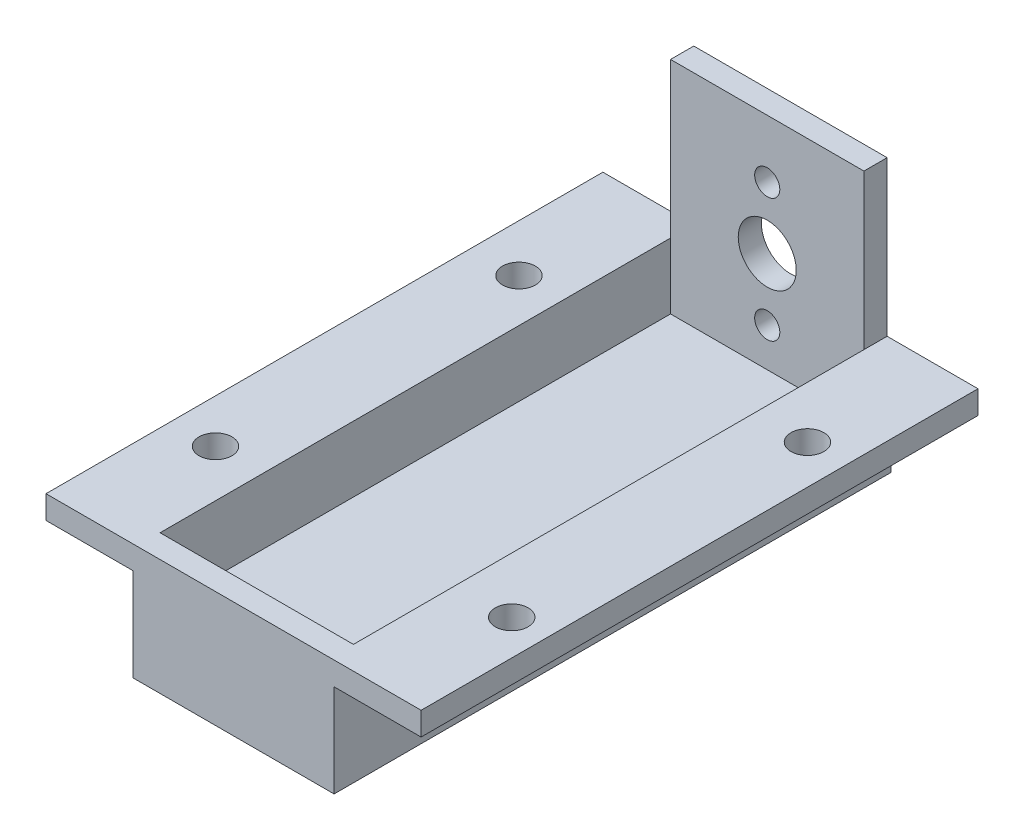
ISO-10303-21;
HEADER;
FILE_DESCRIPTION(('STEP AP214'),'2;1');
FILE_NAME('part.step','',(''),(''),'','','');
FILE_SCHEMA(('AUTOMOTIVE_DESIGN { 1 0 10303 214 1 1 1 1 }'));
ENDSEC;
DATA;
#1=APPLICATION_CONTEXT('core data for automotive mechanical design processes');
#2=APPLICATION_PROTOCOL_DEFINITION('international standard','automotive_design',2000,#1);
#3=PRODUCT_CONTEXT('',#1,'mechanical');
#4=PRODUCT('Part','Part','',(#3));
#5=PRODUCT_RELATED_PRODUCT_CATEGORY('part','',(#4));
#6=PRODUCT_DEFINITION_FORMATION('','',#4);
#7=PRODUCT_DEFINITION_CONTEXT('part definition',#1,'design');
#8=PRODUCT_DEFINITION('design','',#6,#7);
#9=PRODUCT_DEFINITION_SHAPE('','',#8);
#10=(LENGTH_UNIT() NAMED_UNIT(*) SI_UNIT(.MILLI.,.METRE.));
#11=(NAMED_UNIT(*) PLANE_ANGLE_UNIT() SI_UNIT($,.RADIAN.));
#12=(NAMED_UNIT(*) SI_UNIT($,.STERADIAN.) SOLID_ANGLE_UNIT());
#13=UNCERTAINTY_MEASURE_WITH_UNIT(LENGTH_MEASURE(1.E-05),#10,'distance_accuracy_value','');
#14=(GEOMETRIC_REPRESENTATION_CONTEXT(3) GLOBAL_UNCERTAINTY_ASSIGNED_CONTEXT((#13)) GLOBAL_UNIT_ASSIGNED_CONTEXT((#10,
#11,#12)) REPRESENTATION_CONTEXT('',''));
#15=CARTESIAN_POINT('',(0.,0.,0.));
#16=DIRECTION('',(0.,0.,1.));
#17=DIRECTION('',(1.,0.,0.));
#18=AXIS2_PLACEMENT_3D('',#15,#16,#17);
#19=CARTESIAN_POINT('',(12.5,0.,72.));
#20=DIRECTION('',(1.,0.,0.));
#21=DIRECTION('',(0.,1.,0.));
#22=AXIS2_PLACEMENT_3D('',#19,#20,#21);
#23=PLANE('',#22);
#24=DIRECTION('',(0.,0.,-1.));
#25=VECTOR('',#24,1.);
#26=CARTESIAN_POINT('',(12.5,0.,72.));
#27=LINE('',#26,#25);
#28=CARTESIAN_POINT('',(12.5,0.,2.99999999999999));
#29=VERTEX_POINT('',#28);
#30=CARTESIAN_POINT('',(12.5,0.,0.));
#31=VERTEX_POINT('',#30);
#32=EDGE_CURVE('E218',#29,#31,#27,.T.);
#33=ORIENTED_EDGE('',*,*,#32,.F.);
#34=DIRECTION('',(0.,1.,0.));
#35=VECTOR('',#34,1.);
#36=CARTESIAN_POINT('',(12.5,0.,2.99999999999999));
#37=LINE('',#36,#35);
#38=CARTESIAN_POINT('',(12.5,-20.,2.99999999999999));
#39=VERTEX_POINT('',#38);
#40=EDGE_CURVE('E310',#39,#29,#37,.T.);
#41=ORIENTED_EDGE('',*,*,#40,.F.);
#42=DIRECTION('',(0.,0.,-1.));
#43=VECTOR('',#42,1.);
#44=CARTESIAN_POINT('',(12.5,-20.,72.));
#45=LINE('',#44,#43);
#46=CARTESIAN_POINT('',(12.5,-20.,0.));
#47=VERTEX_POINT('',#46);
#48=EDGE_CURVE('E221',#39,#47,#45,.T.);
#49=ORIENTED_EDGE('',*,*,#48,.T.);
#50=DIRECTION('',(0.,-1.,0.));
#51=VECTOR('',#50,1.);
#52=CARTESIAN_POINT('',(12.5,0.,0.));
#53=LINE('',#52,#51);
#54=EDGE_CURVE('E190',#31,#47,#53,.T.);
#55=ORIENTED_EDGE('',*,*,#54,.F.);
#56=EDGE_LOOP('',(#33,#41,#49,#55));
#57=FACE_BOUND('',#56,.T.);
#58=ADVANCED_FACE('F45',(#57),#23,.T.);
#59=CARTESIAN_POINT('',(12.5,0.,72.));
#60=DIRECTION('',(0.,-1.,0.));
#61=DIRECTION('',(0.,0.,-1.));
#62=AXIS2_PLACEMENT_3D('',#59,#60,#61);
#63=PLANE('',#62);
#64=DIRECTION('',(-1.,0.,0.));
#65=VECTOR('',#64,1.);
#66=CARTESIAN_POINT('',(-12.5,0.,2.99999999999999));
#67=LINE('',#66,#65);
#68=CARTESIAN_POINT('',(-12.5,0.,2.99999999999999));
#69=VERTEX_POINT('',#68);
#70=EDGE_CURVE('E170',#29,#69,#67,.T.);
#71=ORIENTED_EDGE('',*,*,#70,.F.);
#72=ORIENTED_EDGE('',*,*,#32,.T.);
#73=DIRECTION('',(-1.,0.,0.));
#74=VECTOR('',#73,1.);
#75=CARTESIAN_POINT('',(12.5,0.,0.));
#76=LINE('',#75,#74);
#77=CARTESIAN_POINT('',(-12.5,0.,0.));
#78=VERTEX_POINT('',#77);
#79=EDGE_CURVE('E194',#31,#78,#76,.T.);
#80=ORIENTED_EDGE('',*,*,#79,.T.);
#81=DIRECTION('',(0.,0.,-1.));
#82=VECTOR('',#81,1.);
#83=CARTESIAN_POINT('',(-12.5,0.,72.));
#84=LINE('',#83,#82);
#85=EDGE_CURVE('E215',#69,#78,#84,.T.);
#86=ORIENTED_EDGE('',*,*,#85,.F.);
#87=EDGE_LOOP('',(#71,#72,#80,#86));
#88=FACE_BOUND('',#87,.T.);
#89=ADVANCED_FACE('F357',(#88),#63,.F.);
#90=CARTESIAN_POINT('',(-12.5,0.,72.));
#91=DIRECTION('',(1.,0.,0.));
#92=DIRECTION('',(0.,1.,0.));
#93=AXIS2_PLACEMENT_3D('',#90,#91,#92);
#94=PLANE('',#93);
#95=DIRECTION('',(0.,-1.,0.));
#96=VECTOR('',#95,1.);
#97=CARTESIAN_POINT('',(-12.5,0.,2.99999999999999));
#98=LINE('',#97,#96);
#99=CARTESIAN_POINT('',(-12.5,-20.,2.99999999999999));
#100=VERTEX_POINT('',#99);
#101=EDGE_CURVE('E295',#69,#100,#98,.T.);
#102=ORIENTED_EDGE('',*,*,#101,.F.);
#103=ORIENTED_EDGE('',*,*,#85,.T.);
#104=DIRECTION('',(0.,-1.,0.));
#105=VECTOR('',#104,1.);
#106=CARTESIAN_POINT('',(-12.5,0.,0.));
#107=LINE('',#106,#105);
#108=CARTESIAN_POINT('',(-12.5,-20.,0.));
#109=VERTEX_POINT('',#108);
#110=EDGE_CURVE('E198',#78,#109,#107,.T.);
#111=ORIENTED_EDGE('',*,*,#110,.T.);
#112=DIRECTION('',(0.,0.,-1.));
#113=VECTOR('',#112,1.);
#114=CARTESIAN_POINT('',(-12.5,-20.,72.));
#115=LINE('',#114,#113);
#116=EDGE_CURVE('E154',#100,#109,#115,.T.);
#117=ORIENTED_EDGE('',*,*,#116,.F.);
#118=EDGE_LOOP('',(#102,#103,#111,#117));
#119=FACE_BOUND('',#118,.T.);
#120=ADVANCED_FACE('F359',(#119),#94,.F.);
#121=CARTESIAN_POINT('',(-13.,-23.,72.));
#122=DIRECTION('',(1.,0.,0.));
#123=DIRECTION('',(0.,1.,0.));
#124=AXIS2_PLACEMENT_3D('',#121,#122,#123);
#125=PLANE('',#124);
#126=DIRECTION('',(0.,-1.,0.));
#127=VECTOR('',#126,1.);
#128=CARTESIAN_POINT('',(-13.,-23.,0.));
#129=LINE('',#128,#127);
#130=CARTESIAN_POINT('',(-13.,-23.,0.));
#131=VERTEX_POINT('',#130);
#132=CARTESIAN_POINT('',(-13.,-35.,0.));
#133=VERTEX_POINT('',#132);
#134=EDGE_CURVE('E165',#131,#133,#129,.T.);
#135=ORIENTED_EDGE('',*,*,#134,.T.);
#136=DIRECTION('',(0.,0.,-1.));
#137=VECTOR('',#136,1.);
#138=CARTESIAN_POINT('',(-13.,-35.,72.));
#139=LINE('',#138,#137);
#140=CARTESIAN_POINT('',(-13.,-35.,72.));
#141=VERTEX_POINT('',#140);
#142=EDGE_CURVE('E11',#141,#133,#139,.T.);
#143=ORIENTED_EDGE('',*,*,#142,.F.);
#144=DIRECTION('',(0.,-1.,0.));
#145=VECTOR('',#144,1.);
#146=CARTESIAN_POINT('',(-13.,-23.,72.));
#147=LINE('',#146,#145);
#148=CARTESIAN_POINT('',(-13.,-23.,72.));
#149=VERTEX_POINT('',#148);
#150=EDGE_CURVE('E208',#149,#141,#147,.T.);
#151=ORIENTED_EDGE('',*,*,#150,.F.);
#152=DIRECTION('',(0.,0.,-1.));
#153=VECTOR('',#152,1.);
#154=CARTESIAN_POINT('',(-13.,-23.,72.));
#155=LINE('',#154,#153);
#156=EDGE_CURVE('E161',#149,#131,#155,.T.);
#157=ORIENTED_EDGE('',*,*,#156,.T.);
#158=EDGE_LOOP('',(#135,#143,#151,#157));
#159=FACE_BOUND('',#158,.T.);
#160=ADVANCED_FACE('F47',(#159),#125,.F.);
#161=CARTESIAN_POINT('',(-13.,-35.,72.));
#162=DIRECTION('',(0.,1.,0.));
#163=DIRECTION('',(0.,0.,1.));
#164=AXIS2_PLACEMENT_3D('',#161,#162,#163);
#165=PLANE('',#164);
#166=DIRECTION('',(1.,0.,0.));
#167=VECTOR('',#166,1.);
#168=CARTESIAN_POINT('',(-13.,-35.,0.));
#169=LINE('',#168,#167);
#170=CARTESIAN_POINT('',(13.,-35.,0.));
#171=VERTEX_POINT('',#170);
#172=EDGE_CURVE('E169',#133,#171,#169,.T.);
#173=ORIENTED_EDGE('',*,*,#172,.T.);
#174=DIRECTION('',(0.,0.,-1.));
#175=VECTOR('',#174,1.);
#176=CARTESIAN_POINT('',(13.,-35.,72.));
#177=LINE('',#176,#175);
#178=CARTESIAN_POINT('',(13.,-35.,72.));
#179=VERTEX_POINT('',#178);
#180=EDGE_CURVE('E56',#179,#171,#177,.T.);
#181=ORIENTED_EDGE('',*,*,#180,.F.);
#182=DIRECTION('',(1.,0.,0.));
#183=VECTOR('',#182,1.);
#184=CARTESIAN_POINT('',(-13.,-35.,72.));
#185=LINE('',#184,#183);
#186=EDGE_CURVE('E121',#141,#179,#185,.T.);
#187=ORIENTED_EDGE('',*,*,#186,.F.);
#188=ORIENTED_EDGE('',*,*,#142,.T.);
#189=EDGE_LOOP('',(#173,#181,#187,#188));
#190=FACE_BOUND('',#189,.T.);
#191=ADVANCED_FACE('F417',(#190),#165,.F.);
#192=CARTESIAN_POINT('',(13.,-23.,72.));
#193=DIRECTION('',(1.,0.,0.));
#194=DIRECTION('',(0.,1.,0.));
#195=AXIS2_PLACEMENT_3D('',#192,#193,#194);
#196=PLANE('',#195);
#197=DIRECTION('',(0.,-1.,0.));
#198=VECTOR('',#197,1.);
#199=CARTESIAN_POINT('',(13.,-23.,0.));
#200=LINE('',#199,#198);
#201=CARTESIAN_POINT('',(13.,-23.,0.));
#202=VERTEX_POINT('',#201);
#203=EDGE_CURVE('E174',#202,#171,#200,.T.);
#204=ORIENTED_EDGE('',*,*,#203,.F.);
#205=DIRECTION('',(0.,0.,-1.));
#206=VECTOR('',#205,1.);
#207=CARTESIAN_POINT('',(13.,-23.,72.));
#208=LINE('',#207,#206);
#209=CARTESIAN_POINT('',(13.,-23.,72.));
#210=VERTEX_POINT('',#209);
#211=EDGE_CURVE('E230',#210,#202,#208,.T.);
#212=ORIENTED_EDGE('',*,*,#211,.F.);
#213=DIRECTION('',(0.,-1.,0.));
#214=VECTOR('',#213,1.);
#215=CARTESIAN_POINT('',(13.,-23.,72.));
#216=LINE('',#215,#214);
#217=EDGE_CURVE('E321',#210,#179,#216,.T.);
#218=ORIENTED_EDGE('',*,*,#217,.T.);
#219=ORIENTED_EDGE('',*,*,#180,.T.);
#220=EDGE_LOOP('',(#204,#212,#218,#219));
#221=FACE_BOUND('',#220,.T.);
#222=ADVANCED_FACE('F414',(#221),#196,.T.);
#223=CARTESIAN_POINT('',(24.25,-23.,72.));
#224=DIRECTION('',(0.,-1.,0.));
#225=DIRECTION('',(0.,0.,-1.));
#226=AXIS2_PLACEMENT_3D('',#223,#224,#225);
#227=PLANE('',#226);
#228=CARTESIAN_POINT('',(19.2,-23.,17.));
#229=DIRECTION('',(0.,-1.,0.));
#230=DIRECTION('',(0.,0.,-1.));
#231=AXIS2_PLACEMENT_3D('',#228,#229,#230);
#232=CIRCLE('',#231,2.125);
#233=CARTESIAN_POINT('',(19.2,-23.,14.875));
#234=VERTEX_POINT('',#233);
#235=EDGE_CURVE('E258',#234,#234,#232,.T.);
#236=ORIENTED_EDGE('',*,*,#235,.F.);
#237=EDGE_LOOP('',(#236));
#238=FACE_BOUND('',#237,.T.);
#239=CARTESIAN_POINT('',(19.7,-23.,55.7379233949007));
#240=DIRECTION('',(0.,-1.,0.));
#241=DIRECTION('',(0.,0.,-1.));
#242=AXIS2_PLACEMENT_3D('',#239,#240,#241);
#243=CIRCLE('',#242,2.125);
#244=CARTESIAN_POINT('',(19.7,-23.,53.6129233949007));
#245=VERTEX_POINT('',#244);
#246=EDGE_CURVE('E243',#245,#245,#243,.T.);
#247=ORIENTED_EDGE('',*,*,#246,.F.);
#248=EDGE_LOOP('',(#247));
#249=FACE_BOUND('',#248,.T.);
#250=DIRECTION('',(-1.,0.,0.));
#251=VECTOR('',#250,1.);
#252=CARTESIAN_POINT('',(24.25,-23.,0.));
#253=LINE('',#252,#251);
#254=CARTESIAN_POINT('',(24.25,-23.,0.));
#255=VERTEX_POINT('',#254);
#256=EDGE_CURVE('E178',#255,#202,#253,.T.);
#257=ORIENTED_EDGE('',*,*,#256,.F.);
#258=DIRECTION('',(0.,0.,-1.));
#259=VECTOR('',#258,1.);
#260=CARTESIAN_POINT('',(24.25,-23.,72.));
#261=LINE('',#260,#259);
#262=CARTESIAN_POINT('',(24.25,-23.,72.));
#263=VERTEX_POINT('',#262);
#264=EDGE_CURVE('E227',#263,#255,#261,.T.);
#265=ORIENTED_EDGE('',*,*,#264,.F.);
#266=DIRECTION('',(-1.,0.,0.));
#267=VECTOR('',#266,1.);
#268=CARTESIAN_POINT('',(24.25,-23.,72.));
#269=LINE('',#268,#267);
#270=EDGE_CURVE('E325',#263,#210,#269,.T.);
#271=ORIENTED_EDGE('',*,*,#270,.T.);
#272=ORIENTED_EDGE('',*,*,#211,.T.);
#273=EDGE_LOOP('',(#257,#265,#271,#272));
#274=FACE_BOUND('',#273,.T.);
#275=ADVANCED_FACE('F411',(#238,#249,#274),#227,.T.);
#276=CARTESIAN_POINT('',(24.25,-20.,72.));
#277=DIRECTION('',(1.,0.,0.));
#278=DIRECTION('',(0.,0.,-1.));
#279=AXIS2_PLACEMENT_3D('',#276,#277,#278);
#280=PLANE('',#279);
#281=DIRECTION('',(0.,-1.,0.));
#282=VECTOR('',#281,1.);
#283=CARTESIAN_POINT('',(24.25,-20.,0.));
#284=LINE('',#283,#282);
#285=CARTESIAN_POINT('',(24.25,-20.,0.));
#286=VERTEX_POINT('',#285);
#287=EDGE_CURVE('E182',#286,#255,#284,.T.);
#288=ORIENTED_EDGE('',*,*,#287,.F.);
#289=DIRECTION('',(0.,0.,-1.));
#290=VECTOR('',#289,1.);
#291=CARTESIAN_POINT('',(24.25,-20.,72.));
#292=LINE('',#291,#290);
#293=CARTESIAN_POINT('',(24.25,-20.,72.));
#294=VERTEX_POINT('',#293);
#295=EDGE_CURVE('E224',#294,#286,#292,.T.);
#296=ORIENTED_EDGE('',*,*,#295,.F.);
#297=DIRECTION('',(0.,-1.,0.));
#298=VECTOR('',#297,1.);
#299=CARTESIAN_POINT('',(24.25,-20.,72.));
#300=LINE('',#299,#298);
#301=EDGE_CURVE('E144',#294,#263,#300,.T.);
#302=ORIENTED_EDGE('',*,*,#301,.T.);
#303=ORIENTED_EDGE('',*,*,#264,.T.);
#304=EDGE_LOOP('',(#288,#296,#302,#303));
#305=FACE_BOUND('',#304,.T.);
#306=ADVANCED_FACE('F331',(#305),#280,.T.);
#307=CARTESIAN_POINT('',(-12.5,-20.,72.));
#308=DIRECTION('',(0.,-1.,0.));
#309=DIRECTION('',(1.,0.,0.));
#310=AXIS2_PLACEMENT_3D('',#307,#308,#309);
#311=PLANE('',#310);
#312=CARTESIAN_POINT('',(-18.6,-20.,55.7379233949007));
#313=DIRECTION('',(0.,1.,0.));
#314=DIRECTION('',(-1.,0.,0.));
#315=AXIS2_PLACEMENT_3D('',#312,#313,#314);
#316=CIRCLE('',#315,2.125);
#317=CARTESIAN_POINT('',(-20.725,-20.,55.7379233949007));
#318=VERTEX_POINT('',#317);
#319=EDGE_CURVE('E245',#318,#318,#316,.T.);
#320=ORIENTED_EDGE('',*,*,#319,.F.);
#321=EDGE_LOOP('',(#320));
#322=FACE_BOUND('',#321,.T.);
#323=CARTESIAN_POINT('',(19.2,-20.,17.));
#324=DIRECTION('',(0.,1.,0.));
#325=DIRECTION('',(-1.,0.,0.));
#326=AXIS2_PLACEMENT_3D('',#323,#324,#325);
#327=CIRCLE('',#326,2.125);
#328=CARTESIAN_POINT('',(17.075,-20.,17.));
#329=VERTEX_POINT('',#328);
#330=EDGE_CURVE('E251',#329,#329,#327,.T.);
#331=ORIENTED_EDGE('',*,*,#330,.F.);
#332=EDGE_LOOP('',(#331));
#333=FACE_BOUND('',#332,.T.);
#334=CARTESIAN_POINT('',(19.7,-20.,55.7379233949007));
#335=DIRECTION('',(0.,1.,0.));
#336=DIRECTION('',(-1.,0.,0.));
#337=AXIS2_PLACEMENT_3D('',#334,#335,#336);
#338=CIRCLE('',#337,2.125);
#339=CARTESIAN_POINT('',(17.575,-20.,55.7379233949007));
#340=VERTEX_POINT('',#339);
#341=EDGE_CURVE('E649',#340,#340,#338,.T.);
#342=ORIENTED_EDGE('',*,*,#341,.F.);
#343=EDGE_LOOP('',(#342));
#344=FACE_BOUND('',#343,.T.);
#345=CARTESIAN_POINT('',(-18.1,-20.,17.));
#346=DIRECTION('',(0.,1.,0.));
#347=DIRECTION('',(-1.,0.,0.));
#348=AXIS2_PLACEMENT_3D('',#345,#346,#347);
#349=CIRCLE('',#348,2.125);
#350=CARTESIAN_POINT('',(-20.225,-20.,17.));
#351=VERTEX_POINT('',#350);
#352=EDGE_CURVE('E237',#351,#351,#349,.T.);
#353=ORIENTED_EDGE('',*,*,#352,.F.);
#354=EDGE_LOOP('',(#353));
#355=FACE_BOUND('',#354,.T.);
#356=DIRECTION('',(1.,0.,0.));
#357=VECTOR('',#356,1.);
#358=CARTESIAN_POINT('',(12.5,-20.,69.));
#359=LINE('',#358,#357);
#360=CARTESIAN_POINT('',(-12.5,-20.,69.));
#361=VERTEX_POINT('',#360);
#362=CARTESIAN_POINT('',(12.5,-20.,69.));
#363=VERTEX_POINT('',#362);
#364=EDGE_CURVE('E284',#361,#363,#359,.T.);
#365=ORIENTED_EDGE('',*,*,#364,.F.);
#366=DIRECTION('',(0.,0.,1.));
#367=VECTOR('',#366,1.);
#368=CARTESIAN_POINT('',(-12.5,-20.,69.));
#369=LINE('',#368,#367);
#370=EDGE_CURVE('E262',#100,#361,#369,.T.);
#371=ORIENTED_EDGE('',*,*,#370,.F.);
#372=ORIENTED_EDGE('',*,*,#116,.T.);
#373=DIRECTION('',(-1.,0.,0.));
#374=VECTOR('',#373,1.);
#375=CARTESIAN_POINT('',(-12.5,-20.,0.));
#376=LINE('',#375,#374);
#377=CARTESIAN_POINT('',(-24.25,-20.,0.));
#378=VERTEX_POINT('',#377);
#379=EDGE_CURVE('E152',#109,#378,#376,.T.);
#380=ORIENTED_EDGE('',*,*,#379,.T.);
#381=DIRECTION('',(0.,0.,-1.));
#382=VECTOR('',#381,1.);
#383=CARTESIAN_POINT('',(-24.25,-20.,72.));
#384=LINE('',#383,#382);
#385=CARTESIAN_POINT('',(-24.25,-20.,72.));
#386=VERTEX_POINT('',#385);
#387=EDGE_CURVE('E148',#386,#378,#384,.T.);
#388=ORIENTED_EDGE('',*,*,#387,.F.);
#389=DIRECTION('',(1.,0.,0.));
#390=VECTOR('',#389,1.);
#391=CARTESIAN_POINT('',(12.5,-20.,72.));
#392=LINE('',#391,#390);
#393=EDGE_CURVE('E137',#386,#294,#392,.T.);
#394=ORIENTED_EDGE('',*,*,#393,.T.);
#395=ORIENTED_EDGE('',*,*,#295,.T.);
#396=DIRECTION('',(1.,0.,0.));
#397=VECTOR('',#396,1.);
#398=CARTESIAN_POINT('',(12.5,-20.,0.));
#399=LINE('',#398,#397);
#400=EDGE_CURVE('E186',#47,#286,#399,.T.);
#401=ORIENTED_EDGE('',*,*,#400,.F.);
#402=ORIENTED_EDGE('',*,*,#48,.F.);
#403=DIRECTION('',(0.,0.,-1.));
#404=VECTOR('',#403,1.);
#405=CARTESIAN_POINT('',(12.5,-20.,2.99999999999999));
#406=LINE('',#405,#404);
#407=EDGE_CURVE('E268',#363,#39,#406,.T.);
#408=ORIENTED_EDGE('',*,*,#407,.F.);
#409=EDGE_LOOP('',(#365,#371,#372,#380,#388,#394,#395,#401,#402,#408));
#410=FACE_BOUND('',#409,.T.);
#411=ADVANCED_FACE('F150',(#322,#333,#344,#355,#410),#311,.F.);
#412=CARTESIAN_POINT('',(-24.25,-20.,72.));
#413=DIRECTION('',(1.,0.,0.));
#414=DIRECTION('',(0.,0.,-1.));
#415=AXIS2_PLACEMENT_3D('',#412,#413,#414);
#416=PLANE('',#415);
#417=DIRECTION('',(0.,-1.,0.));
#418=VECTOR('',#417,1.);
#419=CARTESIAN_POINT('',(-24.25,-20.,0.));
#420=LINE('',#419,#418);
#421=CARTESIAN_POINT('',(-24.25,-23.,0.));
#422=VERTEX_POINT('',#421);
#423=EDGE_CURVE('E107',#378,#422,#420,.T.);
#424=ORIENTED_EDGE('',*,*,#423,.T.);
#425=DIRECTION('',(0.,0.,-1.));
#426=VECTOR('',#425,1.);
#427=CARTESIAN_POINT('',(-24.25,-23.,72.));
#428=LINE('',#427,#426);
#429=CARTESIAN_POINT('',(-24.25,-23.,72.));
#430=VERTEX_POINT('',#429);
#431=EDGE_CURVE('E155',#430,#422,#428,.T.);
#432=ORIENTED_EDGE('',*,*,#431,.F.);
#433=DIRECTION('',(0.,-1.,0.));
#434=VECTOR('',#433,1.);
#435=CARTESIAN_POINT('',(-24.25,-20.,72.));
#436=LINE('',#435,#434);
#437=EDGE_CURVE('E141',#386,#430,#436,.T.);
#438=ORIENTED_EDGE('',*,*,#437,.F.);
#439=ORIENTED_EDGE('',*,*,#387,.T.);
#440=EDGE_LOOP('',(#424,#432,#438,#439));
#441=FACE_BOUND('',#440,.T.);
#442=ADVANCED_FACE('F157',(#441),#416,.F.);
#443=CARTESIAN_POINT('',(-24.25,-23.,72.));
#444=DIRECTION('',(0.,1.,0.));
#445=DIRECTION('',(0.,0.,1.));
#446=AXIS2_PLACEMENT_3D('',#443,#444,#445);
#447=PLANE('',#446);
#448=CARTESIAN_POINT('',(-18.6,-23.,55.7379233949007));
#449=DIRECTION('',(0.,1.,0.));
#450=DIRECTION('',(0.,0.,1.));
#451=AXIS2_PLACEMENT_3D('',#448,#449,#450);
#452=CIRCLE('',#451,2.125);
#453=CARTESIAN_POINT('',(-18.6,-23.,57.8629233949007));
#454=VERTEX_POINT('',#453);
#455=EDGE_CURVE('E49',#454,#454,#452,.T.);
#456=ORIENTED_EDGE('',*,*,#455,.T.);
#457=EDGE_LOOP('',(#456));
#458=FACE_BOUND('',#457,.T.);
#459=CARTESIAN_POINT('',(-18.1,-23.,17.));
#460=DIRECTION('',(0.,1.,0.));
#461=DIRECTION('',(0.,0.,1.));
#462=AXIS2_PLACEMENT_3D('',#459,#460,#461);
#463=CIRCLE('',#462,2.125);
#464=CARTESIAN_POINT('',(-18.1,-23.,19.125));
#465=VERTEX_POINT('',#464);
#466=EDGE_CURVE('E234',#465,#465,#463,.T.);
#467=ORIENTED_EDGE('',*,*,#466,.T.);
#468=EDGE_LOOP('',(#467));
#469=FACE_BOUND('',#468,.T.);
#470=DIRECTION('',(1.,0.,0.));
#471=VECTOR('',#470,1.);
#472=CARTESIAN_POINT('',(-24.25,-23.,0.));
#473=LINE('',#472,#471);
#474=EDGE_CURVE('E113',#422,#131,#473,.T.);
#475=ORIENTED_EDGE('',*,*,#474,.T.);
#476=ORIENTED_EDGE('',*,*,#156,.F.);
#477=DIRECTION('',(1.,0.,0.));
#478=VECTOR('',#477,1.);
#479=CARTESIAN_POINT('',(-24.25,-23.,72.));
#480=LINE('',#479,#478);
#481=EDGE_CURVE('E65',#430,#149,#480,.T.);
#482=ORIENTED_EDGE('',*,*,#481,.F.);
#483=ORIENTED_EDGE('',*,*,#431,.T.);
#484=EDGE_LOOP('',(#475,#476,#482,#483));
#485=FACE_BOUND('',#484,.T.);
#486=ADVANCED_FACE('F429',(#458,#469,#485),#447,.F.);
#487=CARTESIAN_POINT('',(0.,0.,72.));
#488=DIRECTION('',(0.,0.,1.));
#489=DIRECTION('',(1.,0.,0.));
#490=AXIS2_PLACEMENT_3D('',#487,#488,#489);
#491=PLANE('',#490);
#492=ORIENTED_EDGE('',*,*,#393,.F.);
#493=ORIENTED_EDGE('',*,*,#437,.T.);
#494=ORIENTED_EDGE('',*,*,#481,.T.);
#495=ORIENTED_EDGE('',*,*,#150,.T.);
#496=ORIENTED_EDGE('',*,*,#186,.T.);
#497=ORIENTED_EDGE('',*,*,#217,.F.);
#498=ORIENTED_EDGE('',*,*,#270,.F.);
#499=ORIENTED_EDGE('',*,*,#301,.F.);
#500=EDGE_LOOP('',(#492,#493,#494,#495,#496,#497,#498,#499));
#501=FACE_BOUND('',#500,.T.);
#502=ADVANCED_FACE('F139',(#501),#491,.T.);
#503=CARTESIAN_POINT('',(0.,0.,0.));
#504=DIRECTION('',(0.,0.,1.));
#505=DIRECTION('',(1.,0.,0.));
#506=AXIS2_PLACEMENT_3D('',#503,#504,#505);
#507=PLANE('',#506);
#508=CARTESIAN_POINT('',(0.,-7.5,0.));
#509=DIRECTION('',(0.,0.,-1.));
#510=DIRECTION('',(-1.,0.,0.));
#511=AXIS2_PLACEMENT_3D('',#508,#509,#510);
#512=CIRCLE('',#511,1.625);
#513=CARTESIAN_POINT('',(-1.625,-7.5,0.));
#514=VERTEX_POINT('',#513);
#515=EDGE_CURVE('E628',#514,#514,#512,.T.);
#516=ORIENTED_EDGE('',*,*,#515,.F.);
#517=EDGE_LOOP('',(#516));
#518=FACE_BOUND('',#517,.T.);
#519=CARTESIAN_POINT('',(0.,-15.5,0.));
#520=DIRECTION('',(0.,0.,-1.));
#521=DIRECTION('',(-1.,0.,0.));
#522=AXIS2_PLACEMENT_3D('',#519,#520,#521);
#523=CIRCLE('',#522,3.75);
#524=CARTESIAN_POINT('',(-3.75,-15.5,0.));
#525=VERTEX_POINT('',#524);
#526=EDGE_CURVE('E632',#525,#525,#523,.T.);
#527=ORIENTED_EDGE('',*,*,#526,.F.);
#528=EDGE_LOOP('',(#527));
#529=FACE_BOUND('',#528,.T.);
#530=CARTESIAN_POINT('',(0.,-23.5,0.));
#531=DIRECTION('',(0.,0.,-1.));
#532=DIRECTION('',(-1.,0.,0.));
#533=AXIS2_PLACEMENT_3D('',#530,#531,#532);
#534=CIRCLE('',#533,1.625);
#535=CARTESIAN_POINT('',(-1.625,-23.5,0.));
#536=VERTEX_POINT('',#535);
#537=EDGE_CURVE('E635',#536,#536,#534,.T.);
#538=ORIENTED_EDGE('',*,*,#537,.F.);
#539=EDGE_LOOP('',(#538));
#540=FACE_BOUND('',#539,.T.);
#541=ORIENTED_EDGE('',*,*,#134,.F.);
#542=ORIENTED_EDGE('',*,*,#474,.F.);
#543=ORIENTED_EDGE('',*,*,#423,.F.);
#544=ORIENTED_EDGE('',*,*,#379,.F.);
#545=ORIENTED_EDGE('',*,*,#110,.F.);
#546=ORIENTED_EDGE('',*,*,#79,.F.);
#547=ORIENTED_EDGE('',*,*,#54,.T.);
#548=ORIENTED_EDGE('',*,*,#400,.T.);
#549=ORIENTED_EDGE('',*,*,#287,.T.);
#550=ORIENTED_EDGE('',*,*,#256,.T.);
#551=ORIENTED_EDGE('',*,*,#203,.T.);
#552=ORIENTED_EDGE('',*,*,#172,.F.);
#553=EDGE_LOOP('',(#541,#542,#543,#544,#545,#546,#547,#548,#549,#550,#551,#552));
#554=FACE_BOUND('',#553,.T.);
#555=ADVANCED_FACE('F341',(#518,#529,#540,#554),#507,.F.);
#556=CARTESIAN_POINT('',(0.,0.,2.99999999999999));
#557=DIRECTION('',(0.,0.,1.));
#558=DIRECTION('',(1.,0.,0.));
#559=AXIS2_PLACEMENT_3D('',#556,#557,#558);
#560=PLANE('',#559);
#561=CARTESIAN_POINT('',(0.,-7.5,3.));
#562=DIRECTION('',(0.,0.,-1.));
#563=DIRECTION('',(-1.,0.,0.));
#564=AXIS2_PLACEMENT_3D('',#561,#562,#563);
#565=CIRCLE('',#564,1.625);
#566=CARTESIAN_POINT('',(-1.625,-7.5,3.));
#567=VERTEX_POINT('',#566);
#568=EDGE_CURVE('E652',#567,#567,#565,.T.);
#569=ORIENTED_EDGE('',*,*,#568,.T.);
#570=EDGE_LOOP('',(#569));
#571=FACE_BOUND('',#570,.T.);
#572=CARTESIAN_POINT('',(0.,-15.5,3.));
#573=DIRECTION('',(0.,0.,-1.));
#574=DIRECTION('',(-1.,0.,0.));
#575=AXIS2_PLACEMENT_3D('',#572,#573,#574);
#576=CIRCLE('',#575,3.75);
#577=CARTESIAN_POINT('',(-3.75,-15.5,3.));
#578=VERTEX_POINT('',#577);
#579=EDGE_CURVE('E638',#578,#578,#576,.T.);
#580=ORIENTED_EDGE('',*,*,#579,.T.);
#581=EDGE_LOOP('',(#580));
#582=FACE_BOUND('',#581,.T.);
#583=CARTESIAN_POINT('',(0.,-23.5,3.));
#584=DIRECTION('',(0.,0.,-1.));
#585=DIRECTION('',(-1.,0.,0.));
#586=AXIS2_PLACEMENT_3D('',#583,#584,#585);
#587=CIRCLE('',#586,1.625);
#588=CARTESIAN_POINT('',(-1.625,-23.5,3.));
#589=VERTEX_POINT('',#588);
#590=EDGE_CURVE('E639',#589,#589,#587,.T.);
#591=ORIENTED_EDGE('',*,*,#590,.T.);
#592=EDGE_LOOP('',(#591));
#593=FACE_BOUND('',#592,.T.);
#594=ORIENTED_EDGE('',*,*,#101,.T.);
#595=DIRECTION('',(0.,1.,0.));
#596=VECTOR('',#595,1.);
#597=CARTESIAN_POINT('',(-12.5,-28.5,2.99999999999999));
#598=LINE('',#597,#596);
#599=CARTESIAN_POINT('',(-12.5,-28.5,2.99999999999999));
#600=VERTEX_POINT('',#599);
#601=EDGE_CURVE('E291',#600,#100,#598,.T.);
#602=ORIENTED_EDGE('',*,*,#601,.F.);
#603=DIRECTION('',(-1.,0.,0.));
#604=VECTOR('',#603,1.);
#605=CARTESIAN_POINT('',(-12.5,-28.5,2.99999999999999));
#606=LINE('',#605,#604);
#607=CARTESIAN_POINT('',(12.5,-28.5,2.99999999999999));
#608=VERTEX_POINT('',#607);
#609=EDGE_CURVE('E276',#608,#600,#606,.T.);
#610=ORIENTED_EDGE('',*,*,#609,.F.);
#611=DIRECTION('',(0.,1.,0.));
#612=VECTOR('',#611,1.);
#613=CARTESIAN_POINT('',(12.5,-28.5,2.99999999999999));
#614=LINE('',#613,#612);
#615=EDGE_CURVE('E296',#608,#39,#614,.T.);
#616=ORIENTED_EDGE('',*,*,#615,.T.);
#617=ORIENTED_EDGE('',*,*,#40,.T.);
#618=ORIENTED_EDGE('',*,*,#70,.T.);
#619=EDGE_LOOP('',(#594,#602,#610,#616,#617,#618));
#620=FACE_BOUND('',#619,.T.);
#621=ADVANCED_FACE('F351',(#571,#582,#593,#620),#560,.T.);
#622=CARTESIAN_POINT('',(-12.5,-28.5,69.));
#623=DIRECTION('',(-1.,0.,0.));
#624=DIRECTION('',(0.,-1.,0.));
#625=AXIS2_PLACEMENT_3D('',#622,#623,#624);
#626=PLANE('',#625);
#627=ORIENTED_EDGE('',*,*,#370,.T.);
#628=DIRECTION('',(0.,1.,0.));
#629=VECTOR('',#628,1.);
#630=CARTESIAN_POINT('',(-12.5,-28.5,69.));
#631=LINE('',#630,#629);
#632=CARTESIAN_POINT('',(-12.5,-28.5,69.));
#633=VERTEX_POINT('',#632);
#634=EDGE_CURVE('E280',#633,#361,#631,.T.);
#635=ORIENTED_EDGE('',*,*,#634,.F.);
#636=DIRECTION('',(0.,0.,1.));
#637=VECTOR('',#636,1.);
#638=CARTESIAN_POINT('',(-12.5,-28.5,69.));
#639=LINE('',#638,#637);
#640=EDGE_CURVE('E263',#600,#633,#639,.T.);
#641=ORIENTED_EDGE('',*,*,#640,.F.);
#642=ORIENTED_EDGE('',*,*,#601,.T.);
#643=EDGE_LOOP('',(#627,#635,#641,#642));
#644=FACE_BOUND('',#643,.T.);
#645=ADVANCED_FACE('F388',(#644),#626,.F.);
#646=CARTESIAN_POINT('',(12.5,-28.5,2.99999999999999));
#647=DIRECTION('',(1.,0.,0.));
#648=DIRECTION('',(0.,1.,0.));
#649=AXIS2_PLACEMENT_3D('',#646,#647,#648);
#650=PLANE('',#649);
#651=ORIENTED_EDGE('',*,*,#407,.T.);
#652=ORIENTED_EDGE('',*,*,#615,.F.);
#653=DIRECTION('',(0.,0.,-1.));
#654=VECTOR('',#653,1.);
#655=CARTESIAN_POINT('',(12.5,-28.5,2.99999999999999));
#656=LINE('',#655,#654);
#657=CARTESIAN_POINT('',(12.5,-28.5,69.));
#658=VERTEX_POINT('',#657);
#659=EDGE_CURVE('E272',#658,#608,#656,.T.);
#660=ORIENTED_EDGE('',*,*,#659,.F.);
#661=DIRECTION('',(0.,1.,0.));
#662=VECTOR('',#661,1.);
#663=CARTESIAN_POINT('',(12.5,-28.5,69.));
#664=LINE('',#663,#662);
#665=EDGE_CURVE('E300',#658,#363,#664,.T.);
#666=ORIENTED_EDGE('',*,*,#665,.T.);
#667=EDGE_LOOP('',(#651,#652,#660,#666));
#668=FACE_BOUND('',#667,.T.);
#669=ADVANCED_FACE('F385',(#668),#650,.F.);
#670=CARTESIAN_POINT('',(12.5,-28.5,69.));
#671=DIRECTION('',(0.,0.,1.));
#672=DIRECTION('',(1.,0.,0.));
#673=AXIS2_PLACEMENT_3D('',#670,#671,#672);
#674=PLANE('',#673);
#675=ORIENTED_EDGE('',*,*,#364,.T.);
#676=ORIENTED_EDGE('',*,*,#665,.F.);
#677=DIRECTION('',(1.,0.,0.));
#678=VECTOR('',#677,1.);
#679=CARTESIAN_POINT('',(12.5,-28.5,69.));
#680=LINE('',#679,#678);
#681=EDGE_CURVE('E267',#633,#658,#680,.T.);
#682=ORIENTED_EDGE('',*,*,#681,.F.);
#683=ORIENTED_EDGE('',*,*,#634,.T.);
#684=EDGE_LOOP('',(#675,#676,#682,#683));
#685=FACE_BOUND('',#684,.T.);
#686=ADVANCED_FACE('F383',(#685),#674,.F.);
#687=CARTESIAN_POINT('',(0.,-28.5,0.));
#688=DIRECTION('',(0.,-1.,0.));
#689=DIRECTION('',(1.,0.,0.));
#690=AXIS2_PLACEMENT_3D('',#687,#688,#689);
#691=PLANE('',#690);
#692=ORIENTED_EDGE('',*,*,#640,.T.);
#693=ORIENTED_EDGE('',*,*,#681,.T.);
#694=ORIENTED_EDGE('',*,*,#659,.T.);
#695=ORIENTED_EDGE('',*,*,#609,.T.);
#696=EDGE_LOOP('',(#692,#693,#694,#695));
#697=FACE_BOUND('',#696,.T.);
#698=ADVANCED_FACE('F387',(#697),#691,.F.);
#699=CARTESIAN_POINT('',(-18.1,-28.5,17.));
#700=DIRECTION('',(0.,1.,0.));
#701=DIRECTION('',(-1.,0.,0.));
#702=AXIS2_PLACEMENT_3D('',#699,#700,#701);
#703=CYLINDRICAL_SURFACE('',#702,2.125);
#704=ORIENTED_EDGE('',*,*,#352,.T.);
#705=EDGE_LOOP('',(#704));
#706=FACE_BOUND('',#705,.T.);
#707=ORIENTED_EDGE('',*,*,#466,.F.);
#708=EDGE_LOOP('',(#707));
#709=FACE_BOUND('',#708,.T.);
#710=ADVANCED_FACE('F491',(#706,#709),#703,.F.);
#711=CARTESIAN_POINT('',(-18.6,-28.5,55.7379233949007));
#712=DIRECTION('',(0.,1.,0.));
#713=DIRECTION('',(-1.,0.,0.));
#714=AXIS2_PLACEMENT_3D('',#711,#712,#713);
#715=CYLINDRICAL_SURFACE('',#714,2.125);
#716=ORIENTED_EDGE('',*,*,#319,.T.);
#717=EDGE_LOOP('',(#716));
#718=FACE_BOUND('',#717,.T.);
#719=ORIENTED_EDGE('',*,*,#455,.F.);
#720=EDGE_LOOP('',(#719));
#721=FACE_BOUND('',#720,.T.);
#722=ADVANCED_FACE('F498',(#718,#721),#715,.F.);
#723=CARTESIAN_POINT('',(19.7,-28.5,55.7379233949007));
#724=DIRECTION('',(0.,1.,0.));
#725=DIRECTION('',(-1.,0.,0.));
#726=AXIS2_PLACEMENT_3D('',#723,#724,#725);
#727=CYLINDRICAL_SURFACE('',#726,2.125);
#728=ORIENTED_EDGE('',*,*,#246,.T.);
#729=EDGE_LOOP('',(#728));
#730=FACE_BOUND('',#729,.T.);
#731=ORIENTED_EDGE('',*,*,#341,.T.);
#732=EDGE_LOOP('',(#731));
#733=FACE_BOUND('',#732,.T.);
#734=ADVANCED_FACE('F506',(#730,#733),#727,.F.);
#735=CARTESIAN_POINT('',(19.2,-28.5,17.));
#736=DIRECTION('',(0.,1.,0.));
#737=DIRECTION('',(-1.,0.,0.));
#738=AXIS2_PLACEMENT_3D('',#735,#736,#737);
#739=CYLINDRICAL_SURFACE('',#738,2.125);
#740=ORIENTED_EDGE('',*,*,#235,.T.);
#741=EDGE_LOOP('',(#740));
#742=FACE_BOUND('',#741,.T.);
#743=ORIENTED_EDGE('',*,*,#330,.T.);
#744=EDGE_LOOP('',(#743));
#745=FACE_BOUND('',#744,.T.);
#746=ADVANCED_FACE('F515',(#742,#745),#739,.F.);
#747=CARTESIAN_POINT('',(0.,-23.5,3.));
#748=DIRECTION('',(0.,0.,-1.));
#749=DIRECTION('',(-1.,0.,0.));
#750=AXIS2_PLACEMENT_3D('',#747,#748,#749);
#751=CYLINDRICAL_SURFACE('',#750,1.625);
#752=ORIENTED_EDGE('',*,*,#590,.F.);
#753=EDGE_LOOP('',(#752));
#754=FACE_BOUND('',#753,.T.);
#755=ORIENTED_EDGE('',*,*,#537,.T.);
#756=EDGE_LOOP('',(#755));
#757=FACE_BOUND('',#756,.T.);
#758=ADVANCED_FACE('F524',(#754,#757),#751,.F.);
#759=CARTESIAN_POINT('',(0.,-15.5,3.));
#760=DIRECTION('',(0.,0.,-1.));
#761=DIRECTION('',(-1.,0.,0.));
#762=AXIS2_PLACEMENT_3D('',#759,#760,#761);
#763=CYLINDRICAL_SURFACE('',#762,3.75);
#764=ORIENTED_EDGE('',*,*,#579,.F.);
#765=EDGE_LOOP('',(#764));
#766=FACE_BOUND('',#765,.T.);
#767=ORIENTED_EDGE('',*,*,#526,.T.);
#768=EDGE_LOOP('',(#767));
#769=FACE_BOUND('',#768,.T.);
#770=ADVANCED_FACE('F533',(#766,#769),#763,.F.);
#771=CARTESIAN_POINT('',(0.,-7.5,3.));
#772=DIRECTION('',(0.,0.,-1.));
#773=DIRECTION('',(-1.,0.,0.));
#774=AXIS2_PLACEMENT_3D('',#771,#772,#773);
#775=CYLINDRICAL_SURFACE('',#774,1.625);
#776=ORIENTED_EDGE('',*,*,#568,.F.);
#777=EDGE_LOOP('',(#776));
#778=FACE_BOUND('',#777,.T.);
#779=ORIENTED_EDGE('',*,*,#515,.T.);
#780=EDGE_LOOP('',(#779));
#781=FACE_BOUND('',#780,.T.);
#782=ADVANCED_FACE('F542',(#778,#781),#775,.F.);
#783=CLOSED_SHELL('',(#58,#89,#120,#160,#191,#222,#275,#306,#411,#442,#486,#502,#555,#621,#645,
#669,#686,#698,#710,#722,#734,#746,#758,#770,#782));
#784=MANIFOLD_SOLID_BREP('B2',#783);
#785=ADVANCED_BREP_SHAPE_REPRESENTATION('',(#18,#784),#14);
#786=SHAPE_DEFINITION_REPRESENTATION(#9,#785);
ENDSEC;
END-ISO-10303-21;
